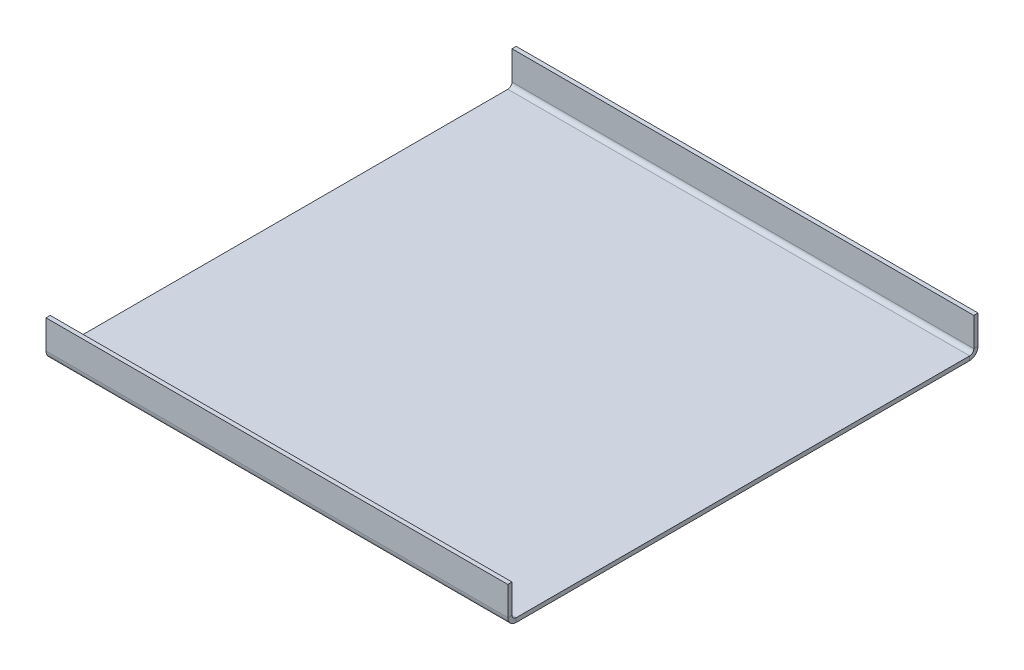
ISO-10303-21;
HEADER;
FILE_DESCRIPTION(('STEP AP214'),'2;1');
FILE_NAME('part.step','',(''),(''),'','','');
FILE_SCHEMA(('AUTOMOTIVE_DESIGN { 1 0 10303 214 1 1 1 1 }'));
ENDSEC;
DATA;
#1=APPLICATION_CONTEXT('core data for automotive mechanical design processes');
#2=APPLICATION_PROTOCOL_DEFINITION('international standard','automotive_design',2000,#1);
#3=PRODUCT_CONTEXT('',#1,'mechanical');
#4=PRODUCT('Part','Part','',(#3));
#5=PRODUCT_RELATED_PRODUCT_CATEGORY('part','',(#4));
#6=PRODUCT_DEFINITION_FORMATION('','',#4);
#7=PRODUCT_DEFINITION_CONTEXT('part definition',#1,'design');
#8=PRODUCT_DEFINITION('design','',#6,#7);
#9=PRODUCT_DEFINITION_SHAPE('','',#8);
#10=(LENGTH_UNIT() NAMED_UNIT(*) SI_UNIT(.MILLI.,.METRE.));
#11=(NAMED_UNIT(*) PLANE_ANGLE_UNIT() SI_UNIT($,.RADIAN.));
#12=(NAMED_UNIT(*) SI_UNIT($,.STERADIAN.) SOLID_ANGLE_UNIT());
#13=UNCERTAINTY_MEASURE_WITH_UNIT(LENGTH_MEASURE(1.E-05),#10,'distance_accuracy_value','');
#14=(GEOMETRIC_REPRESENTATION_CONTEXT(3) GLOBAL_UNCERTAINTY_ASSIGNED_CONTEXT((#13)) GLOBAL_UNIT_ASSIGNED_CONTEXT((#10,
#11,#12)) REPRESENTATION_CONTEXT('',''));
#15=CARTESIAN_POINT('',(0.,0.,0.));
#16=DIRECTION('',(0.,0.,1.));
#17=DIRECTION('',(1.,0.,0.));
#18=AXIS2_PLACEMENT_3D('',#15,#16,#17);
#19=CARTESIAN_POINT('',(175.,0.,-175.));
#20=DIRECTION('',(-1.,0.,0.));
#21=DIRECTION('',(0.,0.,1.));
#22=AXIS2_PLACEMENT_3D('',#19,#20,#21);
#23=PLANE('',#22);
#24=DIRECTION('',(0.,1.,0.));
#25=VECTOR('',#24,1.);
#26=CARTESIAN_POINT('',(175.,0.,171.82));
#27=LINE('',#26,#25);
#28=CARTESIAN_POINT('',(175.,-3.18,171.82));
#29=VERTEX_POINT('',#28);
#30=CARTESIAN_POINT('',(175.,0.,171.82));
#31=VERTEX_POINT('',#30);
#32=EDGE_CURVE('E11',#29,#31,#27,.T.);
#33=ORIENTED_EDGE('',*,*,#32,.F.);
#34=DIRECTION('',(0.,0.,1.));
#35=VECTOR('',#34,1.);
#36=CARTESIAN_POINT('',(175.,-3.18,0.));
#37=LINE('',#36,#35);
#38=CARTESIAN_POINT('',(175.,-3.18,-171.82));
#39=VERTEX_POINT('',#38);
#40=EDGE_CURVE('E148',#39,#29,#37,.T.);
#41=ORIENTED_EDGE('',*,*,#40,.F.);
#42=DIRECTION('',(0.,1.,0.));
#43=VECTOR('',#42,1.);
#44=CARTESIAN_POINT('',(175.,0.,-171.82));
#45=LINE('',#44,#43);
#46=CARTESIAN_POINT('',(175.,0.,-171.82));
#47=VERTEX_POINT('',#46);
#48=EDGE_CURVE('E48',#39,#47,#45,.T.);
#49=ORIENTED_EDGE('',*,*,#48,.T.);
#50=DIRECTION('',(0.,0.,1.));
#51=VECTOR('',#50,1.);
#52=CARTESIAN_POINT('',(175.,0.,-175.));
#53=LINE('',#52,#51);
#54=EDGE_CURVE('E251',#47,#31,#53,.T.);
#55=ORIENTED_EDGE('',*,*,#54,.T.);
#56=EDGE_LOOP('',(#33,#41,#49,#55));
#57=FACE_BOUND('',#56,.T.);
#58=ADVANCED_FACE('F38',(#57),#23,.F.);
#59=CARTESIAN_POINT('',(175.,3.18,-171.82));
#60=DIRECTION('',(-1.,0.,0.));
#61=DIRECTION('',(0.,0.,1.));
#62=AXIS2_PLACEMENT_3D('',#59,#60,#61);
#63=PLANE('',#62);
#64=ORIENTED_EDGE('',*,*,#48,.F.);
#65=CARTESIAN_POINT('',(175.,3.18,-171.82));
#66=DIRECTION('',(1.,0.,0.));
#67=DIRECTION('',(0.,0.,-1.));
#68=AXIS2_PLACEMENT_3D('',#65,#66,#67);
#69=CIRCLE('',#68,6.36);
#70=CARTESIAN_POINT('',(175.,3.17999999999999,-178.18));
#71=VERTEX_POINT('',#70);
#72=EDGE_CURVE('E151',#39,#71,#69,.T.);
#73=ORIENTED_EDGE('',*,*,#72,.T.);
#74=DIRECTION('',(0.,0.,1.));
#75=VECTOR('',#74,1.);
#76=CARTESIAN_POINT('',(175.,3.18,-175.));
#77=LINE('',#76,#75);
#78=CARTESIAN_POINT('',(175.,3.18,-175.));
#79=VERTEX_POINT('',#78);
#80=EDGE_CURVE('E184',#71,#79,#77,.T.);
#81=ORIENTED_EDGE('',*,*,#80,.T.);
#82=CARTESIAN_POINT('',(175.,3.18,-171.82));
#83=DIRECTION('',(1.,0.,0.));
#84=DIRECTION('',(0.,0.,-1.));
#85=AXIS2_PLACEMENT_3D('',#82,#83,#84);
#86=CIRCLE('',#85,3.18);
#87=EDGE_CURVE('E192',#47,#79,#86,.T.);
#88=ORIENTED_EDGE('',*,*,#87,.F.);
#89=EDGE_LOOP('',(#64,#73,#81,#88));
#90=FACE_BOUND('',#89,.T.);
#91=ADVANCED_FACE('F191',(#90),#63,.F.);
#92=CARTESIAN_POINT('',(175.,-3.18,-175.));
#93=DIRECTION('',(-1.,0.,0.));
#94=DIRECTION('',(0.,1.,0.));
#95=AXIS2_PLACEMENT_3D('',#92,#93,#94);
#96=PLANE('',#95);
#97=ORIENTED_EDGE('',*,*,#80,.F.);
#98=DIRECTION('',(0.,-1.,0.));
#99=VECTOR('',#98,1.);
#100=CARTESIAN_POINT('',(175.,-3.18,-178.18));
#101=LINE('',#100,#99);
#102=CARTESIAN_POINT('',(175.,25.,-178.18));
#103=VERTEX_POINT('',#102);
#104=EDGE_CURVE('E129',#71,#103,#101,.F.);
#105=ORIENTED_EDGE('',*,*,#104,.T.);
#106=DIRECTION('',(0.,0.,1.));
#107=VECTOR('',#106,1.);
#108=CARTESIAN_POINT('',(175.,25.,-175.));
#109=LINE('',#108,#107);
#110=CARTESIAN_POINT('',(175.,25.,-175.));
#111=VERTEX_POINT('',#110);
#112=EDGE_CURVE('E181',#103,#111,#109,.T.);
#113=ORIENTED_EDGE('',*,*,#112,.T.);
#114=DIRECTION('',(0.,1.,0.));
#115=VECTOR('',#114,1.);
#116=CARTESIAN_POINT('',(175.,-3.18,-175.));
#117=LINE('',#116,#115);
#118=EDGE_CURVE('E211',#79,#111,#117,.T.);
#119=ORIENTED_EDGE('',*,*,#118,.F.);
#120=EDGE_LOOP('',(#97,#105,#113,#119));
#121=FACE_BOUND('',#120,.T.);
#122=ADVANCED_FACE('F212',(#121),#96,.F.);
#123=CARTESIAN_POINT('',(175.,25.,-175.));
#124=DIRECTION('',(0.,1.,0.));
#125=DIRECTION('',(1.,0.,0.));
#126=AXIS2_PLACEMENT_3D('',#123,#124,#125);
#127=PLANE('',#126);
#128=ORIENTED_EDGE('',*,*,#112,.F.);
#129=DIRECTION('',(1.,0.,0.));
#130=VECTOR('',#129,1.);
#131=CARTESIAN_POINT('',(175.,25.,-178.18));
#132=LINE('',#131,#130);
#133=CARTESIAN_POINT('',(-175.,25.,-178.18));
#134=VERTEX_POINT('',#133);
#135=EDGE_CURVE('E155',#134,#103,#132,.T.);
#136=ORIENTED_EDGE('',*,*,#135,.F.);
#137=DIRECTION('',(0.,0.,1.));
#138=VECTOR('',#137,1.);
#139=CARTESIAN_POINT('',(-175.,25.,-175.));
#140=LINE('',#139,#138);
#141=CARTESIAN_POINT('',(-175.,25.,-175.));
#142=VERTEX_POINT('',#141);
#143=EDGE_CURVE('E178',#134,#142,#140,.T.);
#144=ORIENTED_EDGE('',*,*,#143,.T.);
#145=DIRECTION('',(1.,0.,0.));
#146=VECTOR('',#145,1.);
#147=CARTESIAN_POINT('',(175.,25.,-175.));
#148=LINE('',#147,#146);
#149=EDGE_CURVE('E216',#142,#111,#148,.T.);
#150=ORIENTED_EDGE('',*,*,#149,.T.);
#151=EDGE_LOOP('',(#128,#136,#144,#150));
#152=FACE_BOUND('',#151,.T.);
#153=ADVANCED_FACE('F247',(#152),#127,.T.);
#154=CARTESIAN_POINT('',(-175.,-3.18,-175.));
#155=DIRECTION('',(-1.,0.,0.));
#156=DIRECTION('',(0.,1.,0.));
#157=AXIS2_PLACEMENT_3D('',#154,#155,#156);
#158=PLANE('',#157);
#159=ORIENTED_EDGE('',*,*,#143,.F.);
#160=DIRECTION('',(0.,-1.,0.));
#161=VECTOR('',#160,1.);
#162=CARTESIAN_POINT('',(-175.,-3.18,-178.18));
#163=LINE('',#162,#161);
#164=CARTESIAN_POINT('',(-175.,3.18,-178.18));
#165=VERTEX_POINT('',#164);
#166=EDGE_CURVE('E152',#165,#134,#163,.F.);
#167=ORIENTED_EDGE('',*,*,#166,.F.);
#168=DIRECTION('',(0.,0.,1.));
#169=VECTOR('',#168,1.);
#170=CARTESIAN_POINT('',(-175.,3.18,-175.));
#171=LINE('',#170,#169);
#172=CARTESIAN_POINT('',(-175.,3.18,-175.));
#173=VERTEX_POINT('',#172);
#174=EDGE_CURVE('E175',#165,#173,#171,.T.);
#175=ORIENTED_EDGE('',*,*,#174,.T.);
#176=DIRECTION('',(0.,1.,0.));
#177=VECTOR('',#176,1.);
#178=CARTESIAN_POINT('',(-175.,-3.18,-175.));
#179=LINE('',#178,#177);
#180=EDGE_CURVE('E221',#173,#142,#179,.T.);
#181=ORIENTED_EDGE('',*,*,#180,.T.);
#182=EDGE_LOOP('',(#159,#167,#175,#181));
#183=FACE_BOUND('',#182,.T.);
#184=ADVANCED_FACE('F298',(#183),#158,.T.);
#185=CARTESIAN_POINT('',(-175.,3.18,-171.82));
#186=DIRECTION('',(1.,0.,0.));
#187=DIRECTION('',(0.,0.,-1.));
#188=AXIS2_PLACEMENT_3D('',#185,#186,#187);
#189=PLANE('',#188);
#190=ORIENTED_EDGE('',*,*,#174,.F.);
#191=CARTESIAN_POINT('',(-175.,3.18,-171.82));
#192=DIRECTION('',(1.,0.,0.));
#193=DIRECTION('',(0.,0.,-1.));
#194=AXIS2_PLACEMENT_3D('',#191,#192,#193);
#195=CIRCLE('',#194,6.36);
#196=CARTESIAN_POINT('',(-175.,-3.18,-171.82));
#197=VERTEX_POINT('',#196);
#198=EDGE_CURVE('E145',#165,#197,#195,.F.);
#199=ORIENTED_EDGE('',*,*,#198,.T.);
#200=DIRECTION('',(0.,1.,0.));
#201=VECTOR('',#200,1.);
#202=CARTESIAN_POINT('',(-175.,0.,-171.82));
#203=LINE('',#202,#201);
#204=CARTESIAN_POINT('',(-175.,0.,-171.82));
#205=VERTEX_POINT('',#204);
#206=EDGE_CURVE('E173',#197,#205,#203,.T.);
#207=ORIENTED_EDGE('',*,*,#206,.T.);
#208=CARTESIAN_POINT('',(-175.,3.18,-171.82));
#209=DIRECTION('',(-1.,0.,0.));
#210=DIRECTION('',(0.,0.,1.));
#211=AXIS2_PLACEMENT_3D('',#208,#209,#210);
#212=CIRCLE('',#211,3.18);
#213=EDGE_CURVE('E207',#173,#205,#212,.T.);
#214=ORIENTED_EDGE('',*,*,#213,.F.);
#215=EDGE_LOOP('',(#190,#199,#207,#214));
#216=FACE_BOUND('',#215,.T.);
#217=ADVANCED_FACE('F300',(#216),#189,.F.);
#218=CARTESIAN_POINT('',(-175.,0.,0.));
#219=DIRECTION('',(-1.,0.,0.));
#220=DIRECTION('',(0.,0.,1.));
#221=AXIS2_PLACEMENT_3D('',#218,#219,#220);
#222=PLANE('',#221);
#223=ORIENTED_EDGE('',*,*,#206,.F.);
#224=DIRECTION('',(0.,0.,1.));
#225=VECTOR('',#224,1.);
#226=CARTESIAN_POINT('',(-175.,-3.18,0.));
#227=LINE('',#226,#225);
#228=CARTESIAN_POINT('',(-175.,-3.18,171.82));
#229=VERTEX_POINT('',#228);
#230=EDGE_CURVE('E143',#197,#229,#227,.T.);
#231=ORIENTED_EDGE('',*,*,#230,.T.);
#232=DIRECTION('',(0.,1.,0.));
#233=VECTOR('',#232,1.);
#234=CARTESIAN_POINT('',(-175.,0.,171.82));
#235=LINE('',#234,#233);
#236=CARTESIAN_POINT('',(-175.,0.,171.82));
#237=VERTEX_POINT('',#236);
#238=EDGE_CURVE('E170',#229,#237,#235,.T.);
#239=ORIENTED_EDGE('',*,*,#238,.T.);
#240=DIRECTION('',(0.,0.,1.));
#241=VECTOR('',#240,1.);
#242=CARTESIAN_POINT('',(-175.,0.,0.));
#243=LINE('',#242,#241);
#244=EDGE_CURVE('E255',#205,#237,#243,.T.);
#245=ORIENTED_EDGE('',*,*,#244,.F.);
#246=EDGE_LOOP('',(#223,#231,#239,#245));
#247=FACE_BOUND('',#246,.T.);
#248=ADVANCED_FACE('F301',(#247),#222,.T.);
#249=CARTESIAN_POINT('',(-175.,3.18,171.82));
#250=DIRECTION('',(-1.,0.,0.));
#251=DIRECTION('',(0.,0.,1.));
#252=AXIS2_PLACEMENT_3D('',#249,#250,#251);
#253=PLANE('',#252);
#254=ORIENTED_EDGE('',*,*,#238,.F.);
#255=CARTESIAN_POINT('',(-175.,3.18,171.82));
#256=DIRECTION('',(-1.,0.,0.));
#257=DIRECTION('',(0.,0.,1.));
#258=AXIS2_PLACEMENT_3D('',#255,#256,#257);
#259=CIRCLE('',#258,6.36);
#260=CARTESIAN_POINT('',(-175.,3.17999999999999,178.18));
#261=VERTEX_POINT('',#260);
#262=EDGE_CURVE('E130',#229,#261,#259,.T.);
#263=ORIENTED_EDGE('',*,*,#262,.T.);
#264=DIRECTION('',(0.,0.,-1.));
#265=VECTOR('',#264,1.);
#266=CARTESIAN_POINT('',(-175.,3.18,175.));
#267=LINE('',#266,#265);
#268=CARTESIAN_POINT('',(-175.,3.18,175.));
#269=VERTEX_POINT('',#268);
#270=EDGE_CURVE('E167',#261,#269,#267,.T.);
#271=ORIENTED_EDGE('',*,*,#270,.T.);
#272=CARTESIAN_POINT('',(-175.,3.18,171.82));
#273=DIRECTION('',(1.,0.,0.));
#274=DIRECTION('',(0.,0.,-1.));
#275=AXIS2_PLACEMENT_3D('',#272,#273,#274);
#276=CIRCLE('',#275,3.18);
#277=EDGE_CURVE('E232',#237,#269,#276,.F.);
#278=ORIENTED_EDGE('',*,*,#277,.F.);
#279=EDGE_LOOP('',(#254,#263,#271,#278));
#280=FACE_BOUND('',#279,.T.);
#281=ADVANCED_FACE('F283',(#280),#253,.T.);
#282=CARTESIAN_POINT('',(-175.,-3.18,175.));
#283=DIRECTION('',(1.,0.,0.));
#284=DIRECTION('',(0.,1.,0.));
#285=AXIS2_PLACEMENT_3D('',#282,#283,#284);
#286=PLANE('',#285);
#287=ORIENTED_EDGE('',*,*,#270,.F.);
#288=DIRECTION('',(0.,-1.,0.));
#289=VECTOR('',#288,1.);
#290=CARTESIAN_POINT('',(-175.,-3.18,178.18));
#291=LINE('',#290,#289);
#292=CARTESIAN_POINT('',(-175.,25.,178.18));
#293=VERTEX_POINT('',#292);
#294=EDGE_CURVE('E120',#261,#293,#291,.F.);
#295=ORIENTED_EDGE('',*,*,#294,.T.);
#296=DIRECTION('',(0.,0.,-1.));
#297=VECTOR('',#296,1.);
#298=CARTESIAN_POINT('',(-175.,25.,175.));
#299=LINE('',#298,#297);
#300=CARTESIAN_POINT('',(-175.,25.,175.));
#301=VERTEX_POINT('',#300);
#302=EDGE_CURVE('E164',#293,#301,#299,.T.);
#303=ORIENTED_EDGE('',*,*,#302,.T.);
#304=DIRECTION('',(0.,1.,0.));
#305=VECTOR('',#304,1.);
#306=CARTESIAN_POINT('',(-175.,-3.18,175.));
#307=LINE('',#306,#305);
#308=EDGE_CURVE('E258',#269,#301,#307,.T.);
#309=ORIENTED_EDGE('',*,*,#308,.F.);
#310=EDGE_LOOP('',(#287,#295,#303,#309));
#311=FACE_BOUND('',#310,.T.);
#312=ADVANCED_FACE('F287',(#311),#286,.F.);
#313=CARTESIAN_POINT('',(175.,25.,175.));
#314=DIRECTION('',(0.,1.,0.));
#315=DIRECTION('',(-1.,0.,0.));
#316=AXIS2_PLACEMENT_3D('',#313,#314,#315);
#317=PLANE('',#316);
#318=ORIENTED_EDGE('',*,*,#302,.F.);
#319=DIRECTION('',(-1.,0.,0.));
#320=VECTOR('',#319,1.);
#321=CARTESIAN_POINT('',(175.,25.,178.18));
#322=LINE('',#321,#320);
#323=CARTESIAN_POINT('',(175.,25.,178.18));
#324=VERTEX_POINT('',#323);
#325=EDGE_CURVE('E135',#324,#293,#322,.T.);
#326=ORIENTED_EDGE('',*,*,#325,.F.);
#327=DIRECTION('',(0.,0.,-1.));
#328=VECTOR('',#327,1.);
#329=CARTESIAN_POINT('',(175.,25.,175.));
#330=LINE('',#329,#328);
#331=CARTESIAN_POINT('',(175.,25.,175.));
#332=VERTEX_POINT('',#331);
#333=EDGE_CURVE('E109',#324,#332,#330,.T.);
#334=ORIENTED_EDGE('',*,*,#333,.T.);
#335=DIRECTION('',(-1.,0.,0.));
#336=VECTOR('',#335,1.);
#337=CARTESIAN_POINT('',(175.,25.,175.));
#338=LINE('',#337,#336);
#339=EDGE_CURVE('E261',#332,#301,#338,.T.);
#340=ORIENTED_EDGE('',*,*,#339,.T.);
#341=EDGE_LOOP('',(#318,#326,#334,#340));
#342=FACE_BOUND('',#341,.T.);
#343=ADVANCED_FACE('F332',(#342),#317,.T.);
#344=CARTESIAN_POINT('',(175.,-3.18,175.));
#345=DIRECTION('',(1.,0.,0.));
#346=DIRECTION('',(0.,1.,0.));
#347=AXIS2_PLACEMENT_3D('',#344,#345,#346);
#348=PLANE('',#347);
#349=ORIENTED_EDGE('',*,*,#333,.F.);
#350=DIRECTION('',(0.,-1.,0.));
#351=VECTOR('',#350,1.);
#352=CARTESIAN_POINT('',(175.,-3.18,178.18));
#353=LINE('',#352,#351);
#354=CARTESIAN_POINT('',(175.,3.18,178.18));
#355=VERTEX_POINT('',#354);
#356=EDGE_CURVE('E118',#355,#324,#353,.F.);
#357=ORIENTED_EDGE('',*,*,#356,.F.);
#358=DIRECTION('',(0.,0.,-1.));
#359=VECTOR('',#358,1.);
#360=CARTESIAN_POINT('',(175.,3.18,175.));
#361=LINE('',#360,#359);
#362=CARTESIAN_POINT('',(175.,3.18,175.));
#363=VERTEX_POINT('',#362);
#364=EDGE_CURVE('E42',#355,#363,#361,.T.);
#365=ORIENTED_EDGE('',*,*,#364,.T.);
#366=DIRECTION('',(0.,1.,0.));
#367=VECTOR('',#366,1.);
#368=CARTESIAN_POINT('',(175.,-3.18,175.));
#369=LINE('',#368,#367);
#370=EDGE_CURVE('E264',#363,#332,#369,.T.);
#371=ORIENTED_EDGE('',*,*,#370,.T.);
#372=EDGE_LOOP('',(#349,#357,#365,#371));
#373=FACE_BOUND('',#372,.T.);
#374=ADVANCED_FACE('F132',(#373),#348,.T.);
#375=CARTESIAN_POINT('',(175.,3.18,171.82));
#376=DIRECTION('',(1.,0.,0.));
#377=DIRECTION('',(0.,0.,-1.));
#378=AXIS2_PLACEMENT_3D('',#375,#376,#377);
#379=PLANE('',#378);
#380=CARTESIAN_POINT('',(175.,3.18,171.82));
#381=DIRECTION('',(-1.,0.,0.));
#382=DIRECTION('',(0.,0.,1.));
#383=AXIS2_PLACEMENT_3D('',#380,#381,#382);
#384=CIRCLE('',#383,6.36);
#385=EDGE_CURVE('E101',#355,#29,#384,.F.);
#386=ORIENTED_EDGE('',*,*,#385,.T.);
#387=ORIENTED_EDGE('',*,*,#32,.T.);
#388=CARTESIAN_POINT('',(175.,3.18,171.82));
#389=DIRECTION('',(-1.,0.,0.));
#390=DIRECTION('',(0.,0.,1.));
#391=AXIS2_PLACEMENT_3D('',#388,#389,#390);
#392=CIRCLE('',#391,3.18);
#393=EDGE_CURVE('E104',#363,#31,#392,.F.);
#394=ORIENTED_EDGE('',*,*,#393,.F.);
#395=ORIENTED_EDGE('',*,*,#364,.F.);
#396=EDGE_LOOP('',(#386,#387,#394,#395));
#397=FACE_BOUND('',#396,.T.);
#398=ADVANCED_FACE('F40',(#397),#379,.T.);
#399=CARTESIAN_POINT('',(175.,-3.18,175.));
#400=DIRECTION('',(0.,0.,1.));
#401=DIRECTION('',(-1.,0.,0.));
#402=AXIS2_PLACEMENT_3D('',#399,#400,#401);
#403=PLANE('',#402);
#404=ORIENTED_EDGE('',*,*,#370,.F.);
#405=DIRECTION('',(-1.,0.,0.));
#406=VECTOR('',#405,1.);
#407=CARTESIAN_POINT('',(175.,3.18,175.));
#408=LINE('',#407,#406);
#409=EDGE_CURVE('E227',#363,#269,#408,.T.);
#410=ORIENTED_EDGE('',*,*,#409,.T.);
#411=ORIENTED_EDGE('',*,*,#308,.T.);
#412=ORIENTED_EDGE('',*,*,#339,.F.);
#413=EDGE_LOOP('',(#404,#410,#411,#412));
#414=FACE_BOUND('',#413,.T.);
#415=ADVANCED_FACE('F291',(#414),#403,.F.);
#416=CARTESIAN_POINT('',(0.,0.,0.));
#417=DIRECTION('',(0.,1.,0.));
#418=DIRECTION('',(0.,0.,1.));
#419=AXIS2_PLACEMENT_3D('',#416,#417,#418);
#420=PLANE('',#419);
#421=ORIENTED_EDGE('',*,*,#54,.F.);
#422=DIRECTION('',(1.,0.,0.));
#423=VECTOR('',#422,1.);
#424=CARTESIAN_POINT('',(0.,0.,-171.82));
#425=LINE('',#424,#423);
#426=EDGE_CURVE('E110',#47,#205,#425,.F.);
#427=ORIENTED_EDGE('',*,*,#426,.T.);
#428=ORIENTED_EDGE('',*,*,#244,.T.);
#429=DIRECTION('',(-1.,0.,0.));
#430=VECTOR('',#429,1.);
#431=CARTESIAN_POINT('',(0.,0.,171.82));
#432=LINE('',#431,#430);
#433=EDGE_CURVE('E223',#237,#31,#432,.F.);
#434=ORIENTED_EDGE('',*,*,#433,.T.);
#435=EDGE_LOOP('',(#421,#427,#428,#434));
#436=FACE_BOUND('',#435,.T.);
#437=ADVANCED_FACE('F278',(#436),#420,.T.);
#438=CARTESIAN_POINT('',(175.,-3.18,-175.));
#439=DIRECTION('',(0.,0.,-1.));
#440=DIRECTION('',(1.,0.,0.));
#441=AXIS2_PLACEMENT_3D('',#438,#439,#440);
#442=PLANE('',#441);
#443=ORIENTED_EDGE('',*,*,#180,.F.);
#444=DIRECTION('',(1.,0.,0.));
#445=VECTOR('',#444,1.);
#446=CARTESIAN_POINT('',(175.,3.18,-175.));
#447=LINE('',#446,#445);
#448=EDGE_CURVE('E205',#173,#79,#447,.T.);
#449=ORIENTED_EDGE('',*,*,#448,.T.);
#450=ORIENTED_EDGE('',*,*,#118,.T.);
#451=ORIENTED_EDGE('',*,*,#149,.F.);
#452=EDGE_LOOP('',(#443,#449,#450,#451));
#453=FACE_BOUND('',#452,.T.);
#454=ADVANCED_FACE('F219',(#453),#442,.F.);
#455=CARTESIAN_POINT('',(175.,3.18,171.82));
#456=DIRECTION('',(-1.,0.,0.));
#457=DIRECTION('',(0.,0.,1.));
#458=AXIS2_PLACEMENT_3D('',#455,#456,#457);
#459=CYLINDRICAL_SURFACE('',#458,3.18);
#460=ORIENTED_EDGE('',*,*,#393,.T.);
#461=ORIENTED_EDGE('',*,*,#433,.F.);
#462=ORIENTED_EDGE('',*,*,#277,.T.);
#463=ORIENTED_EDGE('',*,*,#409,.F.);
#464=EDGE_LOOP('',(#460,#461,#462,#463));
#465=FACE_BOUND('',#464,.T.);
#466=ADVANCED_FACE('F275',(#465),#459,.F.);
#467=CARTESIAN_POINT('',(175.,3.18,-171.82));
#468=DIRECTION('',(1.,0.,0.));
#469=DIRECTION('',(0.,0.,-1.));
#470=AXIS2_PLACEMENT_3D('',#467,#468,#469);
#471=CYLINDRICAL_SURFACE('',#470,3.18);
#472=ORIENTED_EDGE('',*,*,#213,.T.);
#473=ORIENTED_EDGE('',*,*,#426,.F.);
#474=ORIENTED_EDGE('',*,*,#87,.T.);
#475=ORIENTED_EDGE('',*,*,#448,.F.);
#476=EDGE_LOOP('',(#472,#473,#474,#475));
#477=FACE_BOUND('',#476,.T.);
#478=ADVANCED_FACE('F203',(#477),#471,.F.);
#479=CARTESIAN_POINT('',(175.,-3.18,178.18));
#480=DIRECTION('',(0.,0.,1.));
#481=DIRECTION('',(-1.,0.,0.));
#482=AXIS2_PLACEMENT_3D('',#479,#480,#481);
#483=PLANE('',#482);
#484=ORIENTED_EDGE('',*,*,#356,.T.);
#485=ORIENTED_EDGE('',*,*,#325,.T.);
#486=ORIENTED_EDGE('',*,*,#294,.F.);
#487=DIRECTION('',(-1.,0.,0.));
#488=VECTOR('',#487,1.);
#489=CARTESIAN_POINT('',(175.,3.18,178.18));
#490=LINE('',#489,#488);
#491=EDGE_CURVE('E115',#355,#261,#490,.T.);
#492=ORIENTED_EDGE('',*,*,#491,.F.);
#493=EDGE_LOOP('',(#484,#485,#486,#492));
#494=FACE_BOUND('',#493,.T.);
#495=ADVANCED_FACE('F116',(#494),#483,.T.);
#496=CARTESIAN_POINT('',(0.,-3.18,0.));
#497=DIRECTION('',(0.,1.,0.));
#498=DIRECTION('',(0.,0.,1.));
#499=AXIS2_PLACEMENT_3D('',#496,#497,#498);
#500=PLANE('',#499);
#501=ORIENTED_EDGE('',*,*,#40,.T.);
#502=DIRECTION('',(1.,0.,0.));
#503=VECTOR('',#502,1.);
#504=CARTESIAN_POINT('',(0.,-3.18,171.82));
#505=LINE('',#504,#503);
#506=EDGE_CURVE('E124',#229,#29,#505,.T.);
#507=ORIENTED_EDGE('',*,*,#506,.F.);
#508=ORIENTED_EDGE('',*,*,#230,.F.);
#509=DIRECTION('',(1.,0.,0.));
#510=VECTOR('',#509,1.);
#511=CARTESIAN_POINT('',(0.,-3.18,-171.82));
#512=LINE('',#511,#510);
#513=EDGE_CURVE('E208',#39,#197,#512,.F.);
#514=ORIENTED_EDGE('',*,*,#513,.F.);
#515=EDGE_LOOP('',(#501,#507,#508,#514));
#516=FACE_BOUND('',#515,.T.);
#517=ADVANCED_FACE('F303',(#516),#500,.F.);
#518=CARTESIAN_POINT('',(175.,-3.18,-178.18));
#519=DIRECTION('',(0.,0.,-1.));
#520=DIRECTION('',(1.,0.,0.));
#521=AXIS2_PLACEMENT_3D('',#518,#519,#520);
#522=PLANE('',#521);
#523=ORIENTED_EDGE('',*,*,#166,.T.);
#524=ORIENTED_EDGE('',*,*,#135,.T.);
#525=ORIENTED_EDGE('',*,*,#104,.F.);
#526=DIRECTION('',(1.,0.,0.));
#527=VECTOR('',#526,1.);
#528=CARTESIAN_POINT('',(175.,3.18,-178.18));
#529=LINE('',#528,#527);
#530=EDGE_CURVE('E139',#165,#71,#529,.T.);
#531=ORIENTED_EDGE('',*,*,#530,.F.);
#532=EDGE_LOOP('',(#523,#524,#525,#531));
#533=FACE_BOUND('',#532,.T.);
#534=ADVANCED_FACE('F244',(#533),#522,.T.);
#535=CARTESIAN_POINT('',(175.,3.18,171.82));
#536=DIRECTION('',(-1.,0.,0.));
#537=DIRECTION('',(0.,0.,1.));
#538=AXIS2_PLACEMENT_3D('',#535,#536,#537);
#539=CYLINDRICAL_SURFACE('',#538,6.36);
#540=ORIENTED_EDGE('',*,*,#385,.F.);
#541=ORIENTED_EDGE('',*,*,#491,.T.);
#542=ORIENTED_EDGE('',*,*,#262,.F.);
#543=ORIENTED_EDGE('',*,*,#506,.T.);
#544=EDGE_LOOP('',(#540,#541,#542,#543));
#545=FACE_BOUND('',#544,.T.);
#546=ADVANCED_FACE('F126',(#545),#539,.T.);
#547=CARTESIAN_POINT('',(175.,3.18,-171.82));
#548=DIRECTION('',(1.,0.,0.));
#549=DIRECTION('',(0.,0.,-1.));
#550=AXIS2_PLACEMENT_3D('',#547,#548,#549);
#551=CYLINDRICAL_SURFACE('',#550,6.36);
#552=ORIENTED_EDGE('',*,*,#198,.F.);
#553=ORIENTED_EDGE('',*,*,#530,.T.);
#554=ORIENTED_EDGE('',*,*,#72,.F.);
#555=ORIENTED_EDGE('',*,*,#513,.T.);
#556=EDGE_LOOP('',(#552,#553,#554,#555));
#557=FACE_BOUND('',#556,.T.);
#558=ADVANCED_FACE('F241',(#557),#551,.T.);
#559=CLOSED_SHELL('',(#58,#91,#122,#153,#184,#217,#248,#281,#312,#343,#374,#398,#415,#437,#454,
#466,#478,#495,#517,#534,#546,#558));
#560=MANIFOLD_SOLID_BREP('B2',#559);
#561=ADVANCED_BREP_SHAPE_REPRESENTATION('',(#18,#560),#14);
#562=SHAPE_DEFINITION_REPRESENTATION(#9,#561);
ENDSEC;
END-ISO-10303-21;
